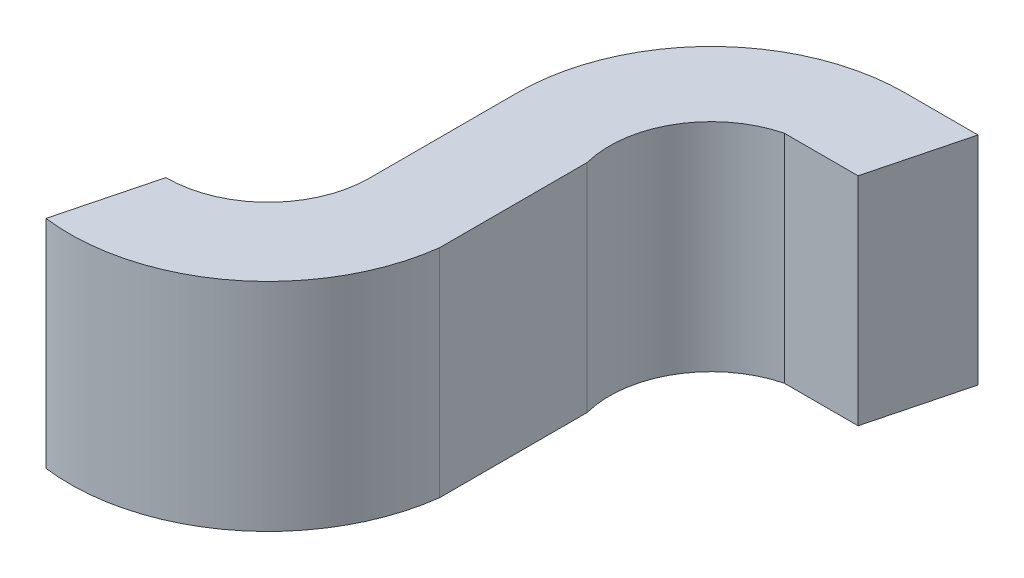
ISO-10303-21;
HEADER;
FILE_DESCRIPTION(('STEP AP214'),'2;1');
FILE_NAME('part.step','',(''),(''),'','','');
FILE_SCHEMA(('AUTOMOTIVE_DESIGN { 1 0 10303 214 1 1 1 1 }'));
ENDSEC;
DATA;
#1=APPLICATION_CONTEXT('core data for automotive mechanical design processes');
#2=APPLICATION_PROTOCOL_DEFINITION('international standard','automotive_design',2000,#1);
#3=PRODUCT_CONTEXT('',#1,'mechanical');
#4=PRODUCT('Part','Part','',(#3));
#5=PRODUCT_RELATED_PRODUCT_CATEGORY('part','',(#4));
#6=PRODUCT_DEFINITION_FORMATION('','',#4);
#7=PRODUCT_DEFINITION_CONTEXT('part definition',#1,'design');
#8=PRODUCT_DEFINITION('design','',#6,#7);
#9=PRODUCT_DEFINITION_SHAPE('','',#8);
#10=(LENGTH_UNIT() NAMED_UNIT(*) SI_UNIT(.MILLI.,.METRE.));
#11=(NAMED_UNIT(*) PLANE_ANGLE_UNIT() SI_UNIT($,.RADIAN.));
#12=(NAMED_UNIT(*) SI_UNIT($,.STERADIAN.) SOLID_ANGLE_UNIT());
#13=UNCERTAINTY_MEASURE_WITH_UNIT(LENGTH_MEASURE(1.E-05),#10,'distance_accuracy_value','');
#14=(GEOMETRIC_REPRESENTATION_CONTEXT(3) GLOBAL_UNCERTAINTY_ASSIGNED_CONTEXT((#13)) GLOBAL_UNIT_ASSIGNED_CONTEXT((#10,
#11,#12)) REPRESENTATION_CONTEXT('',''));
#15=CARTESIAN_POINT('',(0.,0.,0.));
#16=DIRECTION('',(0.,0.,1.));
#17=DIRECTION('',(1.,0.,0.));
#18=AXIS2_PLACEMENT_3D('',#15,#16,#17);
#19=CARTESIAN_POINT('',(0.274206145914,-0.11,0.003074583655185));
#20=DIRECTION('',(0.,0.,-1.));
#21=DIRECTION('',(-1.,0.,0.));
#22=AXIS2_PLACEMENT_3D('',#19,#20,#21);
#23=PLANE('',#22);
#24=DIRECTION('',(1.,0.,0.));
#25=VECTOR('',#24,1.);
#26=CARTESIAN_POINT('',(0.299206145914,-0.11,0.003074583655185));
#27=LINE('',#26,#25);
#28=CARTESIAN_POINT('',(0.274206145913944,-0.11,0.00307458365540305));
#29=VERTEX_POINT('',#28);
#30=CARTESIAN_POINT('',(0.349206145914,-0.11,0.003074583655185));
#31=VERTEX_POINT('',#30);
#32=EDGE_CURVE('E83',#29,#31,#27,.T.);
#33=ORIENTED_EDGE('',*,*,#32,.F.);
#34=DIRECTION('',(0.,1.,0.));
#35=VECTOR('',#34,1.);
#36=CARTESIAN_POINT('',(0.274206145914002,-0.11,0.00307458365562062));
#37=LINE('',#36,#35);
#38=CARTESIAN_POINT('',(0.274206145913944,0.11,0.00307458365540306));
#39=VERTEX_POINT('',#38);
#40=EDGE_CURVE('E175',#39,#29,#37,.F.);
#41=ORIENTED_EDGE('',*,*,#40,.F.);
#42=DIRECTION('',(1.,0.,0.));
#43=VECTOR('',#42,1.);
#44=CARTESIAN_POINT('',(0.299206145914,0.11,0.003074583655185));
#45=LINE('',#44,#43);
#46=CARTESIAN_POINT('',(0.349206145914,0.11,0.003074583655185));
#47=VERTEX_POINT('',#46);
#48=EDGE_CURVE('E105',#47,#39,#45,.F.);
#49=ORIENTED_EDGE('',*,*,#48,.F.);
#50=DIRECTION('',(0.,1.,0.));
#51=VECTOR('',#50,1.);
#52=CARTESIAN_POINT('',(0.349206145914,-0.11,0.003074583655185));
#53=LINE('',#52,#51);
#54=EDGE_CURVE('E93',#47,#31,#53,.F.);
#55=ORIENTED_EDGE('',*,*,#54,.T.);
#56=EDGE_LOOP('',(#33,#41,#49,#55));
#57=FACE_BOUND('',#56,.T.);
#58=ADVANCED_FACE('F17',(#57),#23,.T.);
#59=CARTESIAN_POINT('',(0.349206145914,-0.11,0.003074583655185));
#60=DIRECTION('',(-0.968245836551863,0.,-0.249999999999965));
#61=DIRECTION('',(-0.249999999999965,0.,0.968245836551863));
#62=AXIS2_PLACEMENT_3D('',#59,#60,#61);
#63=PLANE('',#62);
#64=DIRECTION('',(0.250000000000001,0.,-0.968245836551854));
#65=VECTOR('',#64,1.);
#66=CARTESIAN_POINT('',(0.324206145914,0.11,0.09989916731037));
#67=LINE('',#66,#65);
#68=CARTESIAN_POINT('',(0.324206145914,0.11,0.09989916731037));
#69=VERTEX_POINT('',#68);
#70=EDGE_CURVE('E98',#69,#47,#67,.T.);
#71=ORIENTED_EDGE('',*,*,#70,.F.);
#72=DIRECTION('',(0.,1.,0.));
#73=VECTOR('',#72,1.);
#74=CARTESIAN_POINT('',(0.324206145914,0.11,0.09989916731037));
#75=LINE('',#74,#73);
#76=CARTESIAN_POINT('',(0.324206145914001,-0.11,0.0998991673103703));
#77=VERTEX_POINT('',#76);
#78=EDGE_CURVE('E102',#77,#69,#75,.T.);
#79=ORIENTED_EDGE('',*,*,#78,.F.);
#80=DIRECTION('',(-0.249999999999965,0.,0.968245836551863));
#81=VECTOR('',#80,1.);
#82=CARTESIAN_POINT('',(0.349206145914,-0.11,0.003074583655185));
#83=LINE('',#82,#81);
#84=EDGE_CURVE('E126',#31,#77,#83,.T.);
#85=ORIENTED_EDGE('',*,*,#84,.F.);
#86=ORIENTED_EDGE('',*,*,#54,.F.);
#87=EDGE_LOOP('',(#71,#79,#85,#86));
#88=FACE_BOUND('',#87,.T.);
#89=ADVANCED_FACE('F100',(#88),#63,.F.);
#90=CARTESIAN_POINT('',(0.275,-0.11,0.2));
#91=DIRECTION('',(0.,1.,0.));
#92=DIRECTION('',(0.,0.,1.));
#93=AXIS2_PLACEMENT_3D('',#90,#91,#92);
#94=CYLINDRICAL_SURFACE('',#93,0.196927016447);
#95=CARTESIAN_POINT('',(0.275,-0.11,0.2));
#96=DIRECTION('',(0.,1.,0.));
#97=DIRECTION('',(0.,0.,1.));
#98=AXIS2_PLACEMENT_3D('',#95,#96,#97);
#99=CIRCLE('',#98,0.196927016447);
#100=CARTESIAN_POINT('',(0.0780745836554055,-0.11,0.200793854086056));
#101=VERTEX_POINT('',#100);
#102=EDGE_CURVE('E20',#29,#101,#99,.T.);
#103=ORIENTED_EDGE('',*,*,#102,.T.);
#104=DIRECTION('',(0.,1.,0.));
#105=VECTOR('',#104,1.);
#106=CARTESIAN_POINT('',(0.07807458365519,-0.11,0.200793854086));
#107=LINE('',#106,#105);
#108=CARTESIAN_POINT('',(0.0780745836554055,0.11,0.200793854086056));
#109=VERTEX_POINT('',#108);
#110=EDGE_CURVE('E157',#109,#101,#107,.F.);
#111=ORIENTED_EDGE('',*,*,#110,.F.);
#112=CARTESIAN_POINT('',(0.275,0.11,0.2));
#113=DIRECTION('',(0.,1.,0.));
#114=DIRECTION('',(0.,0.,1.));
#115=AXIS2_PLACEMENT_3D('',#112,#113,#114);
#116=CIRCLE('',#115,0.196927016447);
#117=EDGE_CURVE('E115',#109,#39,#116,.F.);
#118=ORIENTED_EDGE('',*,*,#117,.T.);
#119=ORIENTED_EDGE('',*,*,#40,.T.);
#120=EDGE_LOOP('',(#103,#111,#118,#119));
#121=FACE_BOUND('',#120,.T.);
#122=ADVANCED_FACE('F180',(#121),#94,.T.);
#123=CARTESIAN_POINT('',(0.249206145914,0.11,0.09989916731037));
#124=DIRECTION('',(0.,0.,1.));
#125=DIRECTION('',(1.,0.,0.));
#126=AXIS2_PLACEMENT_3D('',#123,#124,#125);
#127=PLANE('',#126);
#128=DIRECTION('',(1.,0.,0.));
#129=VECTOR('',#128,1.);
#130=CARTESIAN_POINT('',(0.249206145914,0.11,0.09989916731037));
#131=LINE('',#130,#129);
#132=CARTESIAN_POINT('',(0.249206145914436,0.11,0.0998991673104996));
#133=VERTEX_POINT('',#132);
#134=EDGE_CURVE('E108',#69,#133,#131,.F.);
#135=ORIENTED_EDGE('',*,*,#134,.T.);
#136=DIRECTION('',(0.,1.,0.));
#137=VECTOR('',#136,1.);
#138=CARTESIAN_POINT('',(0.249206145914058,0.11,0.0998991673105968));
#139=LINE('',#138,#137);
#140=CARTESIAN_POINT('',(0.249206145914436,-0.11,0.0998991673104996));
#141=VERTEX_POINT('',#140);
#142=EDGE_CURVE('E153',#133,#141,#139,.F.);
#143=ORIENTED_EDGE('',*,*,#142,.T.);
#144=DIRECTION('',(1.,0.,0.));
#145=VECTOR('',#144,1.);
#146=CARTESIAN_POINT('',(0.249206145914,-0.11,0.09989916731037));
#147=LINE('',#146,#145);
#148=EDGE_CURVE('E118',#141,#77,#147,.T.);
#149=ORIENTED_EDGE('',*,*,#148,.T.);
#150=ORIENTED_EDGE('',*,*,#78,.T.);
#151=EDGE_LOOP('',(#135,#143,#149,#150));
#152=FACE_BOUND('',#151,.T.);
#153=ADVANCED_FACE('F117',(#152),#127,.T.);
#154=CARTESIAN_POINT('',(0.07807458365519,-0.11,0.350793854086));
#155=DIRECTION('',(-1.,0.,0.));
#156=DIRECTION('',(0.,0.,1.));
#157=AXIS2_PLACEMENT_3D('',#154,#155,#156);
#158=PLANE('',#157);
#159=DIRECTION('',(0.,0.,-1.));
#160=VECTOR('',#159,1.);
#161=CARTESIAN_POINT('',(0.07807458365519,-0.11,0.288293854086));
#162=LINE('',#161,#160);
#163=CARTESIAN_POINT('',(0.0780745836549682,-0.11,0.350793854085943));
#164=VERTEX_POINT('',#163);
#165=EDGE_CURVE('E155',#164,#101,#162,.T.);
#166=ORIENTED_EDGE('',*,*,#165,.F.);
#167=DIRECTION('',(0.,-1.,0.));
#168=VECTOR('',#167,1.);
#169=CARTESIAN_POINT('',(0.0780745836547455,-0.11,0.350793854085997));
#170=LINE('',#169,#168);
#171=CARTESIAN_POINT('',(0.0780745836549682,0.11,0.350793854085943));
#172=VERTEX_POINT('',#171);
#173=EDGE_CURVE('E151',#164,#172,#170,.F.);
#174=ORIENTED_EDGE('',*,*,#173,.T.);
#175=DIRECTION('',(0.,0.,1.));
#176=VECTOR('',#175,1.);
#177=CARTESIAN_POINT('',(0.07807458365519,0.11,0.288293854086));
#178=LINE('',#177,#176);
#179=EDGE_CURVE('E170',#109,#172,#178,.T.);
#180=ORIENTED_EDGE('',*,*,#179,.F.);
#181=ORIENTED_EDGE('',*,*,#110,.T.);
#182=EDGE_LOOP('',(#166,#174,#180,#181));
#183=FACE_BOUND('',#182,.T.);
#184=ADVANCED_FACE('F186',(#183),#158,.T.);
#185=CARTESIAN_POINT('',(0.275,0.11,0.2));
#186=DIRECTION('',(0.,1.,0.));
#187=DIRECTION('',(0.,0.,1.));
#188=AXIS2_PLACEMENT_3D('',#185,#186,#187);
#189=CYLINDRICAL_SURFACE('',#188,0.103370690303);
#190=CARTESIAN_POINT('',(0.275,0.11,0.2));
#191=DIRECTION('',(0.,1.,0.));
#192=DIRECTION('',(0.,0.,1.));
#193=AXIS2_PLACEMENT_3D('',#190,#191,#192);
#194=CIRCLE('',#193,0.103370690303);
#195=CARTESIAN_POINT('',(0.174899167310328,0.11,0.225793854084897));
#196=VERTEX_POINT('',#195);
#197=EDGE_CURVE('E111',#196,#133,#194,.F.);
#198=ORIENTED_EDGE('',*,*,#197,.F.);
#199=DIRECTION('',(0.,1.,0.));
#200=VECTOR('',#199,1.);
#201=CARTESIAN_POINT('',(0.17489916731,0.11,0.225793854086));
#202=LINE('',#201,#200);
#203=CARTESIAN_POINT('',(0.174899167310328,-0.11,0.225793854084897));
#204=VERTEX_POINT('',#203);
#205=EDGE_CURVE('E194',#204,#196,#202,.T.);
#206=ORIENTED_EDGE('',*,*,#205,.F.);
#207=CARTESIAN_POINT('',(0.275,-0.11,0.2));
#208=DIRECTION('',(0.,1.,0.));
#209=DIRECTION('',(0.,0.,1.));
#210=AXIS2_PLACEMENT_3D('',#207,#208,#209);
#211=CIRCLE('',#210,0.103370690303);
#212=EDGE_CURVE('E154',#141,#204,#211,.T.);
#213=ORIENTED_EDGE('',*,*,#212,.F.);
#214=ORIENTED_EDGE('',*,*,#142,.F.);
#215=EDGE_LOOP('',(#198,#206,#213,#214));
#216=FACE_BOUND('',#215,.T.);
#217=ADVANCED_FACE('F258',(#216),#189,.F.);
#218=CARTESIAN_POINT('',(-0.025,-0.11,0.35));
#219=DIRECTION('',(0.,-1.,0.));
#220=DIRECTION('',(0.,0.,-1.));
#221=AXIS2_PLACEMENT_3D('',#218,#219,#220);
#222=CYLINDRICAL_SURFACE('',#221,0.10307764064);
#223=CARTESIAN_POINT('',(-0.025,-0.11,0.35));
#224=DIRECTION('',(0.,-1.,0.));
#225=DIRECTION('',(0.,0.,-1.));
#226=AXIS2_PLACEMENT_3D('',#223,#224,#225);
#227=CIRCLE('',#226,0.10307764064);
#228=CARTESIAN_POINT('',(-0.025793854086167,-0.11,0.453074583654872));
#229=VERTEX_POINT('',#228);
#230=EDGE_CURVE('E148',#164,#229,#227,.T.);
#231=ORIENTED_EDGE('',*,*,#230,.T.);
#232=DIRECTION('',(0.,1.,0.));
#233=VECTOR('',#232,1.);
#234=CARTESIAN_POINT('',(-0.0257938540862,-0.11,0.453074583655));
#235=LINE('',#234,#233);
#236=CARTESIAN_POINT('',(-0.025793854086167,0.11,0.453074583654872));
#237=VERTEX_POINT('',#236);
#238=EDGE_CURVE('E142',#237,#229,#235,.F.);
#239=ORIENTED_EDGE('',*,*,#238,.F.);
#240=CARTESIAN_POINT('',(-0.025,0.11,0.35));
#241=DIRECTION('',(0.,-1.,0.));
#242=DIRECTION('',(0.,0.,-1.));
#243=AXIS2_PLACEMENT_3D('',#240,#241,#242);
#244=CIRCLE('',#243,0.10307764064);
#245=EDGE_CURVE('E143',#237,#172,#244,.F.);
#246=ORIENTED_EDGE('',*,*,#245,.T.);
#247=ORIENTED_EDGE('',*,*,#173,.F.);
#248=EDGE_LOOP('',(#231,#239,#246,#247));
#249=FACE_BOUND('',#248,.T.);
#250=ADVANCED_FACE('F188',(#249),#222,.F.);
#251=CARTESIAN_POINT('',(0.07271722254218,-0.11,0.466517571287));
#252=DIRECTION('',(0.,1.,0.));
#253=DIRECTION('',(0.,0.,1.));
#254=AXIS2_PLACEMENT_3D('',#251,#252,#253);
#255=PLANE('',#254);
#256=CARTESIAN_POINT('',(-0.025,-0.11,0.35));
#257=DIRECTION('',(0.,-1.,0.));
#258=DIRECTION('',(0.,0.,-1.));
#259=AXIS2_PLACEMENT_3D('',#256,#257,#258);
#260=CIRCLE('',#259,0.201556443707);
#261=CARTESIAN_POINT('',(-0.0507938540861569,-0.11,0.549899167309909));
#262=VERTEX_POINT('',#261);
#263=CARTESIAN_POINT('',(0.17489916731,-0.11,0.375793854085727));
#264=VERTEX_POINT('',#263);
#265=EDGE_CURVE('E139',#262,#264,#260,.F.);
#266=ORIENTED_EDGE('',*,*,#265,.F.);
#267=DIRECTION('',(-0.249999999999965,0.,0.968245836551863));
#268=VECTOR('',#267,1.);
#269=CARTESIAN_POINT('',(-0.0257938540862,-0.11,0.453074583655));
#270=LINE('',#269,#268);
#271=EDGE_CURVE('E146',#229,#262,#270,.T.);
#272=ORIENTED_EDGE('',*,*,#271,.F.);
#273=ORIENTED_EDGE('',*,*,#230,.F.);
#274=ORIENTED_EDGE('',*,*,#165,.T.);
#275=ORIENTED_EDGE('',*,*,#102,.F.);
#276=ORIENTED_EDGE('',*,*,#32,.T.);
#277=ORIENTED_EDGE('',*,*,#84,.T.);
#278=ORIENTED_EDGE('',*,*,#148,.F.);
#279=ORIENTED_EDGE('',*,*,#212,.T.);
#280=DIRECTION('',(0.,0.,-1.));
#281=VECTOR('',#280,1.);
#282=CARTESIAN_POINT('',(0.17489916731,-0.11,0.375793854086));
#283=LINE('',#282,#281);
#284=EDGE_CURVE('E150',#264,#204,#283,.T.);
#285=ORIENTED_EDGE('',*,*,#284,.F.);
#286=EDGE_LOOP('',(#266,#272,#273,#274,#275,#276,#277,#278,#279,#285));
#287=FACE_BOUND('',#286,.T.);
#288=ADVANCED_FACE('F182',(#287),#255,.F.);
#289=CARTESIAN_POINT('',(0.17489916731,0.11,0.375793854086));
#290=DIRECTION('',(1.,0.,0.));
#291=DIRECTION('',(0.,0.,-1.));
#292=AXIS2_PLACEMENT_3D('',#289,#290,#291);
#293=PLANE('',#292);
#294=DIRECTION('',(0.,0.,-1.));
#295=VECTOR('',#294,1.);
#296=CARTESIAN_POINT('',(0.17489916731,0.11,0.375793854086));
#297=LINE('',#296,#295);
#298=CARTESIAN_POINT('',(0.17489916731,0.11,0.375793854085727));
#299=VERTEX_POINT('',#298);
#300=EDGE_CURVE('E147',#196,#299,#297,.F.);
#301=ORIENTED_EDGE('',*,*,#300,.T.);
#302=DIRECTION('',(0.,-1.,0.));
#303=VECTOR('',#302,1.);
#304=CARTESIAN_POINT('',(0.174899167309931,0.11,0.375793854085991));
#305=LINE('',#304,#303);
#306=EDGE_CURVE('E138',#264,#299,#305,.F.);
#307=ORIENTED_EDGE('',*,*,#306,.F.);
#308=ORIENTED_EDGE('',*,*,#284,.T.);
#309=ORIENTED_EDGE('',*,*,#205,.T.);
#310=EDGE_LOOP('',(#301,#307,#308,#309));
#311=FACE_BOUND('',#310,.T.);
#312=ADVANCED_FACE('F211',(#311),#293,.T.);
#313=CARTESIAN_POINT('',(0.07271722254218,0.11,0.466517571287));
#314=DIRECTION('',(0.,-1.,0.));
#315=DIRECTION('',(0.,0.,-1.));
#316=AXIS2_PLACEMENT_3D('',#313,#314,#315);
#317=PLANE('',#316);
#318=ORIENTED_EDGE('',*,*,#245,.F.);
#319=DIRECTION('',(-0.249999999999965,0.,0.968245836551863));
#320=VECTOR('',#319,1.);
#321=CARTESIAN_POINT('',(-0.0257938540862,0.11,0.453074583655));
#322=LINE('',#321,#320);
#323=CARTESIAN_POINT('',(-0.0507938540861569,0.11,0.549899167309909));
#324=VERTEX_POINT('',#323);
#325=EDGE_CURVE('E35',#324,#237,#322,.F.);
#326=ORIENTED_EDGE('',*,*,#325,.F.);
#327=CARTESIAN_POINT('',(-0.025,0.11,0.35));
#328=DIRECTION('',(0.,-1.,0.));
#329=DIRECTION('',(0.,0.,-1.));
#330=AXIS2_PLACEMENT_3D('',#327,#328,#329);
#331=CIRCLE('',#330,0.201556443707);
#332=EDGE_CURVE('E26',#299,#324,#331,.T.);
#333=ORIENTED_EDGE('',*,*,#332,.F.);
#334=ORIENTED_EDGE('',*,*,#300,.F.);
#335=ORIENTED_EDGE('',*,*,#197,.T.);
#336=ORIENTED_EDGE('',*,*,#134,.F.);
#337=ORIENTED_EDGE('',*,*,#70,.T.);
#338=ORIENTED_EDGE('',*,*,#48,.T.);
#339=ORIENTED_EDGE('',*,*,#117,.F.);
#340=ORIENTED_EDGE('',*,*,#179,.T.);
#341=EDGE_LOOP('',(#318,#326,#333,#334,#335,#336,#337,#338,#339,#340));
#342=FACE_BOUND('',#341,.T.);
#343=ADVANCED_FACE('F109',(#342),#317,.F.);
#344=CARTESIAN_POINT('',(-0.0257938540862,-0.11,0.453074583655));
#345=DIRECTION('',(-0.968245836551863,0.,-0.249999999999965));
#346=DIRECTION('',(-0.249999999999965,0.,0.968245836551863));
#347=AXIS2_PLACEMENT_3D('',#344,#345,#346);
#348=PLANE('',#347);
#349=ORIENTED_EDGE('',*,*,#325,.T.);
#350=ORIENTED_EDGE('',*,*,#238,.T.);
#351=ORIENTED_EDGE('',*,*,#271,.T.);
#352=DIRECTION('',(0.,-1.,0.));
#353=VECTOR('',#352,1.);
#354=CARTESIAN_POINT('',(-0.0507938540861878,0.11,0.549899167309905));
#355=LINE('',#354,#353);
#356=EDGE_CURVE('E11',#324,#262,#355,.T.);
#357=ORIENTED_EDGE('',*,*,#356,.F.);
#358=EDGE_LOOP('',(#349,#350,#351,#357));
#359=FACE_BOUND('',#358,.T.);
#360=ADVANCED_FACE('F219',(#359),#348,.T.);
#361=CARTESIAN_POINT('',(-0.025,0.11,0.35));
#362=DIRECTION('',(0.,-1.,0.));
#363=DIRECTION('',(0.,0.,-1.));
#364=AXIS2_PLACEMENT_3D('',#361,#362,#363);
#365=CYLINDRICAL_SURFACE('',#364,0.201556443707);
#366=ORIENTED_EDGE('',*,*,#332,.T.);
#367=ORIENTED_EDGE('',*,*,#356,.T.);
#368=ORIENTED_EDGE('',*,*,#265,.T.);
#369=ORIENTED_EDGE('',*,*,#306,.T.);
#370=EDGE_LOOP('',(#366,#367,#368,#369));
#371=FACE_BOUND('',#370,.T.);
#372=ADVANCED_FACE('F210',(#371),#365,.T.);
#373=CLOSED_SHELL('',(#58,#89,#122,#153,#184,#217,#250,#288,#312,#343,#360,#372));
#374=MANIFOLD_SOLID_BREP('B1',#373);
#375=ADVANCED_BREP_SHAPE_REPRESENTATION('',(#18,#374),#14);
#376=SHAPE_DEFINITION_REPRESENTATION(#9,#375);
ENDSEC;
END-ISO-10303-21;
